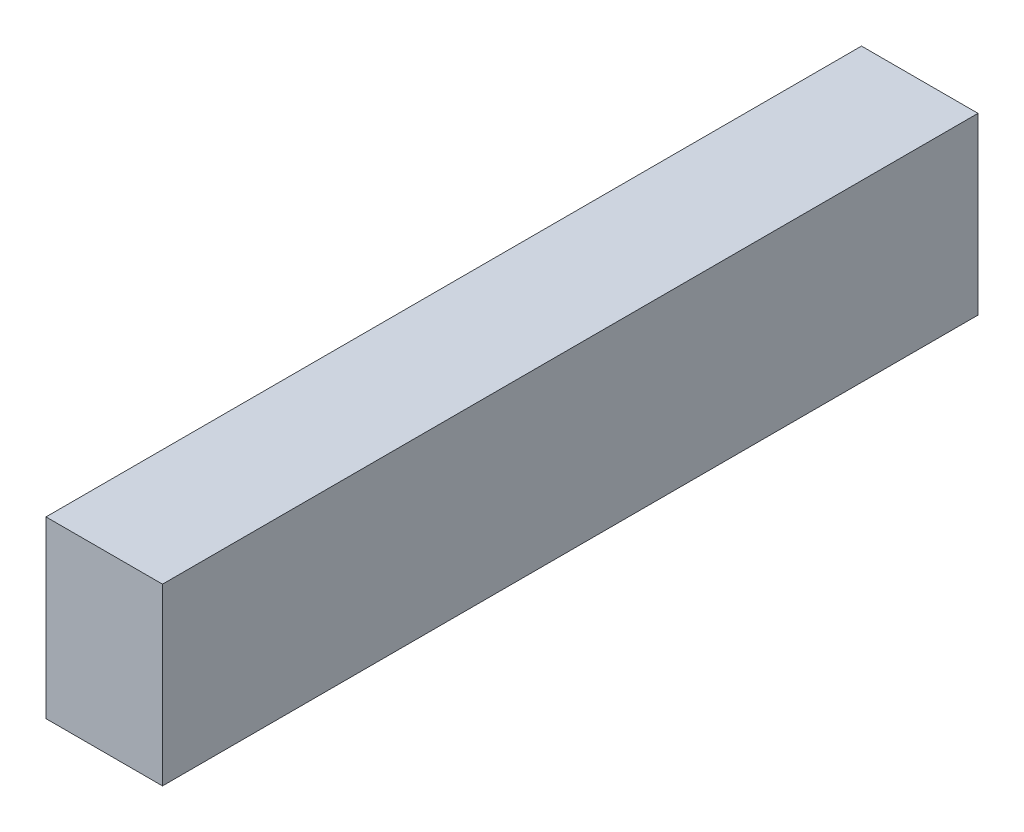
ISO-10303-21;
HEADER;
FILE_DESCRIPTION(('STEP AP214'),'2;1');
FILE_NAME('part.step','',(''),(''),'','','');
FILE_SCHEMA(('AUTOMOTIVE_DESIGN { 1 0 10303 214 1 1 1 1 }'));
ENDSEC;
DATA;
#1=APPLICATION_CONTEXT('core data for automotive mechanical design processes');
#2=APPLICATION_PROTOCOL_DEFINITION('international standard','automotive_design',2000,#1);
#3=PRODUCT_CONTEXT('',#1,'mechanical');
#4=PRODUCT('Part','Part','',(#3));
#5=PRODUCT_RELATED_PRODUCT_CATEGORY('part','',(#4));
#6=PRODUCT_DEFINITION_FORMATION('','',#4);
#7=PRODUCT_DEFINITION_CONTEXT('part definition',#1,'design');
#8=PRODUCT_DEFINITION('design','',#6,#7);
#9=PRODUCT_DEFINITION_SHAPE('','',#8);
#10=(LENGTH_UNIT() NAMED_UNIT(*) SI_UNIT(.MILLI.,.METRE.));
#11=(NAMED_UNIT(*) PLANE_ANGLE_UNIT() SI_UNIT($,.RADIAN.));
#12=(NAMED_UNIT(*) SI_UNIT($,.STERADIAN.) SOLID_ANGLE_UNIT());
#13=UNCERTAINTY_MEASURE_WITH_UNIT(LENGTH_MEASURE(1.E-05),#10,'distance_accuracy_value','');
#14=(GEOMETRIC_REPRESENTATION_CONTEXT(3) GLOBAL_UNCERTAINTY_ASSIGNED_CONTEXT((#13)) GLOBAL_UNIT_ASSIGNED_CONTEXT((#10,
#11,#12)) REPRESENTATION_CONTEXT('',''));
#15=CARTESIAN_POINT('',(0.,0.,0.));
#16=DIRECTION('',(0.,0.,1.));
#17=DIRECTION('',(1.,0.,0.));
#18=AXIS2_PLACEMENT_3D('',#15,#16,#17);
#19=CARTESIAN_POINT('',(70.,1254.,-300.));
#20=DIRECTION('',(-1.,0.,0.));
#21=DIRECTION('',(0.,0.,1.));
#22=AXIS2_PLACEMENT_3D('',#19,#20,#21);
#23=PLANE('',#22);
#24=DIRECTION('',(0.,-1.,0.));
#25=VECTOR('',#24,1.);
#26=CARTESIAN_POINT('',(70.,1254.,-160.));
#27=LINE('',#26,#25);
#28=CARTESIAN_POINT('',(70.,1284.,-160.));
#29=VERTEX_POINT('',#28);
#30=CARTESIAN_POINT('',(70.,1254.,-160.));
#31=VERTEX_POINT('',#30);
#32=EDGE_CURVE('E103',#29,#31,#27,.T.);
#33=ORIENTED_EDGE('',*,*,#32,.F.);
#34=DIRECTION('',(0.,0.,1.));
#35=VECTOR('',#34,1.);
#36=CARTESIAN_POINT('',(70.,1284.,-300.));
#37=LINE('',#36,#35);
#38=CARTESIAN_POINT('',(70.,1284.,-300.));
#39=VERTEX_POINT('',#38);
#40=EDGE_CURVE('E11',#39,#29,#37,.T.);
#41=ORIENTED_EDGE('',*,*,#40,.F.);
#42=DIRECTION('',(0.,-1.,0.));
#43=VECTOR('',#42,1.);
#44=CARTESIAN_POINT('',(70.,1254.,-300.));
#45=LINE('',#44,#43);
#46=CARTESIAN_POINT('',(70.,1254.,-300.));
#47=VERTEX_POINT('',#46);
#48=EDGE_CURVE('E97',#39,#47,#45,.T.);
#49=ORIENTED_EDGE('',*,*,#48,.T.);
#50=DIRECTION('',(0.,0.,1.));
#51=VECTOR('',#50,1.);
#52=CARTESIAN_POINT('',(70.,1254.,-300.));
#53=LINE('',#52,#51);
#54=EDGE_CURVE('E42',#47,#31,#53,.T.);
#55=ORIENTED_EDGE('',*,*,#54,.T.);
#56=EDGE_LOOP('',(#33,#41,#49,#55));
#57=FACE_BOUND('',#56,.T.);
#58=ADVANCED_FACE('F39',(#57),#23,.T.);
#59=CARTESIAN_POINT('',(70.,1284.,-300.));
#60=DIRECTION('',(0.,1.,0.));
#61=DIRECTION('',(0.,0.,1.));
#62=AXIS2_PLACEMENT_3D('',#59,#60,#61);
#63=PLANE('',#62);
#64=DIRECTION('',(-1.,0.,0.));
#65=VECTOR('',#64,1.);
#66=CARTESIAN_POINT('',(70.,1284.,-160.));
#67=LINE('',#66,#65);
#68=CARTESIAN_POINT('',(90.,1284.,-160.));
#69=VERTEX_POINT('',#68);
#70=EDGE_CURVE('E99',#69,#29,#67,.T.);
#71=ORIENTED_EDGE('',*,*,#70,.F.);
#72=DIRECTION('',(0.,0.,1.));
#73=VECTOR('',#72,1.);
#74=CARTESIAN_POINT('',(90.,1284.,-300.));
#75=LINE('',#74,#73);
#76=CARTESIAN_POINT('',(90.,1284.,-300.));
#77=VERTEX_POINT('',#76);
#78=EDGE_CURVE('E48',#77,#69,#75,.T.);
#79=ORIENTED_EDGE('',*,*,#78,.F.);
#80=DIRECTION('',(-1.,0.,0.));
#81=VECTOR('',#80,1.);
#82=CARTESIAN_POINT('',(70.,1284.,-300.));
#83=LINE('',#82,#81);
#84=EDGE_CURVE('E94',#77,#39,#83,.T.);
#85=ORIENTED_EDGE('',*,*,#84,.T.);
#86=ORIENTED_EDGE('',*,*,#40,.T.);
#87=EDGE_LOOP('',(#71,#79,#85,#86));
#88=FACE_BOUND('',#87,.T.);
#89=ADVANCED_FACE('F113',(#88),#63,.T.);
#90=CARTESIAN_POINT('',(90.,1254.,-300.));
#91=DIRECTION('',(1.,0.,0.));
#92=DIRECTION('',(0.,0.,-1.));
#93=AXIS2_PLACEMENT_3D('',#90,#91,#92);
#94=PLANE('',#93);
#95=DIRECTION('',(0.,1.,0.));
#96=VECTOR('',#95,1.);
#97=CARTESIAN_POINT('',(90.,1254.,-160.));
#98=LINE('',#97,#96);
#99=CARTESIAN_POINT('',(90.,1254.,-160.));
#100=VERTEX_POINT('',#99);
#101=EDGE_CURVE('E89',#100,#69,#98,.T.);
#102=ORIENTED_EDGE('',*,*,#101,.F.);
#103=DIRECTION('',(0.,0.,1.));
#104=VECTOR('',#103,1.);
#105=CARTESIAN_POINT('',(90.,1254.,-300.));
#106=LINE('',#105,#104);
#107=CARTESIAN_POINT('',(90.,1254.,-300.));
#108=VERTEX_POINT('',#107);
#109=EDGE_CURVE('E84',#108,#100,#106,.T.);
#110=ORIENTED_EDGE('',*,*,#109,.F.);
#111=DIRECTION('',(0.,1.,0.));
#112=VECTOR('',#111,1.);
#113=CARTESIAN_POINT('',(90.,1254.,-300.));
#114=LINE('',#113,#112);
#115=EDGE_CURVE('E87',#108,#77,#114,.T.);
#116=ORIENTED_EDGE('',*,*,#115,.T.);
#117=ORIENTED_EDGE('',*,*,#78,.T.);
#118=EDGE_LOOP('',(#102,#110,#116,#117));
#119=FACE_BOUND('',#118,.T.);
#120=ADVANCED_FACE('F86',(#119),#94,.T.);
#121=CARTESIAN_POINT('',(70.,1254.,-300.));
#122=DIRECTION('',(0.,-1.,0.));
#123=DIRECTION('',(0.,0.,-1.));
#124=AXIS2_PLACEMENT_3D('',#121,#122,#123);
#125=PLANE('',#124);
#126=DIRECTION('',(1.,0.,0.));
#127=VECTOR('',#126,1.);
#128=CARTESIAN_POINT('',(70.,1254.,-160.));
#129=LINE('',#128,#127);
#130=EDGE_CURVE('E106',#31,#100,#129,.T.);
#131=ORIENTED_EDGE('',*,*,#130,.F.);
#132=ORIENTED_EDGE('',*,*,#54,.F.);
#133=DIRECTION('',(1.,0.,0.));
#134=VECTOR('',#133,1.);
#135=CARTESIAN_POINT('',(70.,1254.,-300.));
#136=LINE('',#135,#134);
#137=EDGE_CURVE('E93',#47,#108,#136,.T.);
#138=ORIENTED_EDGE('',*,*,#137,.T.);
#139=ORIENTED_EDGE('',*,*,#109,.T.);
#140=EDGE_LOOP('',(#131,#132,#138,#139));
#141=FACE_BOUND('',#140,.T.);
#142=ADVANCED_FACE('F96',(#141),#125,.T.);
#143=CARTESIAN_POINT('',(0.,0.,-300.));
#144=DIRECTION('',(0.,0.,-1.));
#145=DIRECTION('',(-1.,0.,0.));
#146=AXIS2_PLACEMENT_3D('',#143,#144,#145);
#147=PLANE('',#146);
#148=ORIENTED_EDGE('',*,*,#48,.F.);
#149=ORIENTED_EDGE('',*,*,#84,.F.);
#150=ORIENTED_EDGE('',*,*,#115,.F.);
#151=ORIENTED_EDGE('',*,*,#137,.F.);
#152=EDGE_LOOP('',(#148,#149,#150,#151));
#153=FACE_BOUND('',#152,.T.);
#154=ADVANCED_FACE('F92',(#153),#147,.T.);
#155=CARTESIAN_POINT('',(0.,0.,-160.));
#156=DIRECTION('',(0.,0.,-1.));
#157=DIRECTION('',(-1.,0.,0.));
#158=AXIS2_PLACEMENT_3D('',#155,#156,#157);
#159=PLANE('',#158);
#160=ORIENTED_EDGE('',*,*,#32,.T.);
#161=ORIENTED_EDGE('',*,*,#130,.T.);
#162=ORIENTED_EDGE('',*,*,#101,.T.);
#163=ORIENTED_EDGE('',*,*,#70,.T.);
#164=EDGE_LOOP('',(#160,#161,#162,#163));
#165=FACE_BOUND('',#164,.T.);
#166=ADVANCED_FACE('F112',(#165),#159,.F.);
#167=CLOSED_SHELL('',(#58,#89,#120,#142,#154,#166));
#168=MANIFOLD_SOLID_BREP('B2',#167);
#169=ADVANCED_BREP_SHAPE_REPRESENTATION('',(#18,#168),#14);
#170=SHAPE_DEFINITION_REPRESENTATION(#9,#169);
ENDSEC;
END-ISO-10303-21;
